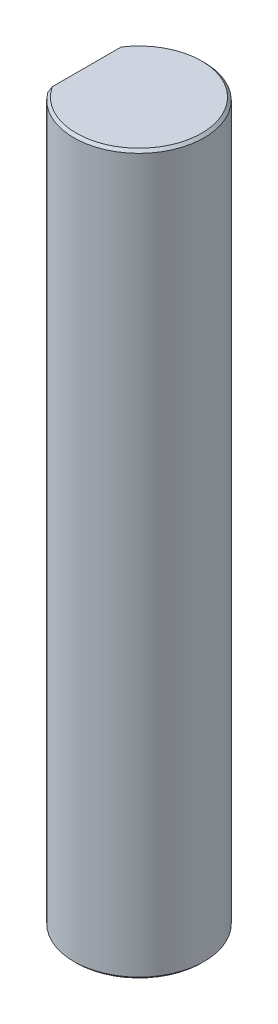
ISO-10303-21;
HEADER;
FILE_DESCRIPTION(('STEP AP214'),'2;1');
FILE_NAME('part.step','',(''),(''),'','','');
FILE_SCHEMA(('AUTOMOTIVE_DESIGN { 1 0 10303 214 1 1 1 1 }'));
ENDSEC;
DATA;
#1=APPLICATION_CONTEXT('core data for automotive mechanical design processes');
#2=APPLICATION_PROTOCOL_DEFINITION('international standard','automotive_design',2000,#1);
#3=PRODUCT_CONTEXT('',#1,'mechanical');
#4=PRODUCT('Part','Part','',(#3));
#5=PRODUCT_RELATED_PRODUCT_CATEGORY('part','',(#4));
#6=PRODUCT_DEFINITION_FORMATION('','',#4);
#7=PRODUCT_DEFINITION_CONTEXT('part definition',#1,'design');
#8=PRODUCT_DEFINITION('design','',#6,#7);
#9=PRODUCT_DEFINITION_SHAPE('','',#8);
#10=(LENGTH_UNIT() NAMED_UNIT(*) SI_UNIT(.MILLI.,.METRE.));
#11=(NAMED_UNIT(*) PLANE_ANGLE_UNIT() SI_UNIT($,.RADIAN.));
#12=(NAMED_UNIT(*) SI_UNIT($,.STERADIAN.) SOLID_ANGLE_UNIT());
#13=UNCERTAINTY_MEASURE_WITH_UNIT(LENGTH_MEASURE(1.E-05),#10,'distance_accuracy_value','');
#14=(GEOMETRIC_REPRESENTATION_CONTEXT(3) GLOBAL_UNCERTAINTY_ASSIGNED_CONTEXT((#13)) GLOBAL_UNIT_ASSIGNED_CONTEXT((#10,
#11,#12)) REPRESENTATION_CONTEXT('',''));
#15=CARTESIAN_POINT('',(0.,0.,0.));
#16=DIRECTION('',(0.,0.,1.));
#17=DIRECTION('',(1.,0.,0.));
#18=AXIS2_PLACEMENT_3D('',#15,#16,#17);
#19=CARTESIAN_POINT('',(-2.54381,34.925,-1.89353550270387));
#20=DIRECTION('',(1.,0.,0.));
#21=DIRECTION('',(0.,0.,-1.));
#22=AXIS2_PLACEMENT_3D('',#19,#20,#21);
#23=PLANE('',#22);
#24=DIRECTION('',(0.,0.,1.));
#25=VECTOR('',#24,1.);
#26=CARTESIAN_POINT('',(-2.54381,34.925,1.89353550270387));
#27=LINE('',#26,#25);
#28=CARTESIAN_POINT('',(-2.54381,34.925,-1.67216130799163));
#29=VERTEX_POINT('',#28);
#30=CARTESIAN_POINT('',(-2.54381,34.925,1.67216130799163));
#31=VERTEX_POINT('',#30);
#32=EDGE_CURVE('E138',#29,#31,#27,.T.);
#33=ORIENTED_EDGE('',*,*,#32,.F.);
#34=CARTESIAN_POINT('',(-2.54381,34.925,-1.67216130799163));
#35=CARTESIAN_POINT('',(-2.54381,34.9044966626707,-1.70943763305416));
#36=CARTESIAN_POINT('',(-2.54381,34.8836616426414,-1.74652367530439));
#37=CARTESIAN_POINT('',(-2.54381,34.8413283071134,-1.8203150722845));
#38=CARTESIAN_POINT('',(-2.54381,34.8198299938063,-1.85702042827168));
#39=CARTESIAN_POINT('',(-2.54381,34.7979999999909,-1.89353550270388));
#40=B_SPLINE_CURVE_WITH_KNOTS('',3,(#34,#35,#36,#37,#38,#39),.UNSPECIFIED.,.F.,.F.,(4,2,4),(0.,
0.127613687763669,0.255226953918805),.UNSPECIFIED.);
#41=CARTESIAN_POINT('',(-2.54381,34.7979999999909,-1.89353550270387));
#42=VERTEX_POINT('',#41);
#43=EDGE_CURVE('E49',#29,#42,#40,.T.);
#44=ORIENTED_EDGE('',*,*,#43,.T.);
#45=DIRECTION('',(0.,-1.,0.));
#46=VECTOR('',#45,1.);
#47=CARTESIAN_POINT('',(-2.54381,34.925,-1.89353550270387));
#48=LINE('',#47,#46);
#49=CARTESIAN_POINT('',(-2.54381,0.127000000044078,-1.89353550270387));
#50=VERTEX_POINT('',#49);
#51=EDGE_CURVE('E77',#42,#50,#48,.T.);
#52=ORIENTED_EDGE('',*,*,#51,.T.);
#53=CARTESIAN_POINT('',(-2.54380999996317,4.40741193541427E-11,-1.67216130798408));
#54=CARTESIAN_POINT('',(-2.54381000042444,0.00501411439717946,-1.68128955351411));
#55=CARTESIAN_POINT('',(-2.54381000882504,0.0100502470336075,-1.69040569787786));
#56=CARTESIAN_POINT('',(-2.54381003266352,0.0201953226391507,-1.70866787814891));
#57=CARTESIAN_POINT('',(-2.54381004814265,0.0253045199337819,-1.71781377277904));
#58=CARTESIAN_POINT('',(-2.54381007716613,0.0355957200603936,-1.73613598515763));
#59=CARTESIAN_POINT('',(-2.54381009069844,0.0407779750322285,-1.74531216126844));
#60=CARTESIAN_POINT('',(-2.54381011027738,0.0512152945980245,-1.7636954537754));
#61=CARTESIAN_POINT('',(-2.54381011627888,0.0564706091047189,-1.77290242827139));
#62=CARTESIAN_POINT('',(-2.54381011823008,0.0670540493882945,-1.79134782044395));
#63=CARTESIAN_POINT('',(-2.54381011411935,0.0723824227518353,-1.80058609605104));
#64=CARTESIAN_POINT('',(-2.54381009707124,0.0831119837402126,-1.81909457916978));
#65=CARTESIAN_POINT('',(-2.54381008408091,0.0885134165586668,-1.8283646445309));
#66=CARTESIAN_POINT('',(-2.54381005426785,0.0993890969974255,-1.84693718221852));
#67=CARTESIAN_POINT('',(-2.54381003742246,0.104863587337332,-1.85623951239918));
#68=CARTESIAN_POINT('',(-2.54381001066232,0.115885392317375,-1.87487704005022));
#69=CARTESIAN_POINT('',(-2.54381000079014,0.12143294719951,-1.88421209545314));
#70=CARTESIAN_POINT('',(-2.54380999996464,0.127000000044076,-1.89353550267756));
#71=B_SPLINE_CURVE_WITH_KNOTS('',3,(#53,#54,#55,#56,#57,#58,#59,#60,#61,#62,#63,#64,#65,#66,#67,
#68,#69,#70),.UNSPECIFIED.,.F.,.F.,(4,2,2,2,2,2,2,2,4),(0.,0.0312440948661208,
0.0626726522340686,0.09428775490835,0.126091425320246,0.158085626719837,0.190272264369233,
0.222653186735185,0.255230186679351),.UNSPECIFIED.);
#72=CARTESIAN_POINT('',(-2.54380999996317,0.,-1.67216130790384));
#73=VERTEX_POINT('',#72);
#74=EDGE_CURVE('E80',#73,#50,#71,.T.);
#75=ORIENTED_EDGE('',*,*,#74,.F.);
#76=DIRECTION('',(0.,0.,-1.));
#77=VECTOR('',#76,1.);
#78=CARTESIAN_POINT('',(-2.54381,0.,-1.89353550270387));
#79=LINE('',#78,#77);
#80=CARTESIAN_POINT('',(-2.54380999998158,2.20370596770714E-11,1.67216130791595));
#81=VERTEX_POINT('',#80);
#82=EDGE_CURVE('E94',#81,#73,#79,.T.);
#83=ORIENTED_EDGE('',*,*,#82,.F.);
#84=CARTESIAN_POINT('',(-2.54380999996464,0.127000000044076,1.89353550267756));
#85=CARTESIAN_POINT('',(-2.54381000079014,0.121432947199514,1.88421209545315));
#86=CARTESIAN_POINT('',(-2.54381001066232,0.115885392317384,1.87487704005024));
#87=CARTESIAN_POINT('',(-2.54381003742246,0.104863587337348,1.85623951239921));
#88=CARTESIAN_POINT('',(-2.54381005426785,0.0993890969974452,1.84693718221856));
#89=CARTESIAN_POINT('',(-2.5438100840809,0.0885134165586913,1.82836464453095));
#90=CARTESIAN_POINT('',(-2.54381009707123,0.0831119837402387,1.81909457916983));
#91=CARTESIAN_POINT('',(-2.54381011411935,0.072382422751864,1.80058609605109));
#92=CARTESIAN_POINT('',(-2.54381011823008,0.0670540493883241,1.791347820444));
#93=CARTESIAN_POINT('',(-2.54381011627888,0.056470609104749,1.77290242827144));
#94=CARTESIAN_POINT('',(-2.54381011027739,0.0512152945980542,1.76369545377545));
#95=CARTESIAN_POINT('',(-2.54381009069845,0.0407779750322554,1.74531216126848));
#96=CARTESIAN_POINT('',(-2.54381007716613,0.0355957200604182,1.73613598515767));
#97=CARTESIAN_POINT('',(-2.54381004814266,0.0253045199338011,1.71781377277907));
#98=CARTESIAN_POINT('',(-2.54381003266352,0.0201953226391669,1.70866787814894));
#99=CARTESIAN_POINT('',(-2.54381000882504,0.0100502470336163,1.69040569787787));
#100=CARTESIAN_POINT('',(-2.54381000042444,0.00501411439718394,1.68128955351412));
#101=CARTESIAN_POINT('',(-2.54380999996317,4.40741193541427E-11,1.67216130798408));
#102=B_SPLINE_CURVE_WITH_KNOTS('',3,(#84,#85,#86,#87,#88,#89,#90,#91,#92,#93,#94,#95,#96,#97,
#98,#99,#100,#101),.UNSPECIFIED.,.F.,.F.,(4,2,2,2,2,2,2,2,4),(0.,0.0325769999441396,
0.0649579223100719,0.0971445599594568,0.129138761359048,0.16094243177095,0.192557534445239,
0.223986091813204,0.255230186679352),.UNSPECIFIED.);
#103=CARTESIAN_POINT('',(-2.54380999998232,0.127000000022039,1.89353550269071));
#104=VERTEX_POINT('',#103);
#105=EDGE_CURVE('E82',#104,#81,#102,.T.);
#106=ORIENTED_EDGE('',*,*,#105,.F.);
#107=DIRECTION('',(0.,-1.,0.));
#108=VECTOR('',#107,1.);
#109=CARTESIAN_POINT('',(-2.54381,34.925,1.89353550270387));
#110=LINE('',#109,#108);
#111=CARTESIAN_POINT('',(-2.54381,34.7979999999909,1.89353550270387));
#112=VERTEX_POINT('',#111);
#113=EDGE_CURVE('E83',#112,#104,#110,.T.);
#114=ORIENTED_EDGE('',*,*,#113,.F.);
#115=CARTESIAN_POINT('',(-2.54381,34.7979999999909,1.89353550270387));
#116=CARTESIAN_POINT('',(-2.54381,34.8198299938063,1.85702042827168));
#117=CARTESIAN_POINT('',(-2.54381,34.8413283071134,1.8203150722845));
#118=CARTESIAN_POINT('',(-2.54381,34.8836616426414,1.74652367530439));
#119=CARTESIAN_POINT('',(-2.54381,34.9044966626707,1.70943763305416));
#120=CARTESIAN_POINT('',(-2.54381,34.925,1.67216130799163));
#121=B_SPLINE_CURVE_WITH_KNOTS('',3,(#115,#116,#117,#118,#119,#120),.UNSPECIFIED.,.F.,.F.,(4,2,
4),(0.,0.127613266155132,0.255226953918802),.UNSPECIFIED.);
#122=EDGE_CURVE('E104',#112,#31,#121,.T.);
#123=ORIENTED_EDGE('',*,*,#122,.T.);
#124=EDGE_LOOP('',(#33,#44,#52,#75,#83,#106,#114,#123));
#125=FACE_BOUND('',#124,.T.);
#126=ADVANCED_FACE('F40',(#125),#23,.F.);
#127=CARTESIAN_POINT('',(0.,0.,0.));
#128=DIRECTION('',(0.,1.,0.));
#129=DIRECTION('',(0.,0.,1.));
#130=AXIS2_PLACEMENT_3D('',#127,#128,#129);
#131=PLANE('',#130);
#132=ORIENTED_EDGE('',*,*,#82,.T.);
#133=CARTESIAN_POINT('',(0.,0.,0.));
#134=DIRECTION('',(0.,1.,0.));
#135=DIRECTION('',(0.,0.,1.));
#136=AXIS2_PLACEMENT_3D('',#133,#134,#135);
#137=CIRCLE('',#136,3.04418999991185);
#138=EDGE_CURVE('E91',#81,#73,#137,.T.);
#139=ORIENTED_EDGE('',*,*,#138,.F.);
#140=EDGE_LOOP('',(#132,#139));
#141=FACE_BOUND('',#140,.T.);
#142=ADVANCED_FACE('F123',(#141),#131,.F.);
#143=CARTESIAN_POINT('',(0.,0.127000000020416,0.));
#144=DIRECTION('',(0.,1.,0.));
#145=DIRECTION('',(0.,0.,1.));
#146=AXIS2_PLACEMENT_3D('',#143,#144,#145);
#147=CONICAL_SURFACE('',#146,3.17118999993227,0.785398163397448);
#148=CARTESIAN_POINT('',(0.,0.127000000000002,0.));
#149=DIRECTION('',(0.,-1.,0.));
#150=DIRECTION('',(0.,0.,-1.));
#151=AXIS2_PLACEMENT_3D('',#148,#149,#150);
#152=CIRCLE('',#151,3.17119);
#153=EDGE_CURVE('E89',#104,#50,#152,.F.);
#154=ORIENTED_EDGE('',*,*,#153,.F.);
#155=ORIENTED_EDGE('',*,*,#105,.T.);
#156=ORIENTED_EDGE('',*,*,#138,.T.);
#157=ORIENTED_EDGE('',*,*,#74,.T.);
#158=EDGE_LOOP('',(#154,#155,#156,#157));
#159=FACE_BOUND('',#158,.T.);
#160=ADVANCED_FACE('F87',(#159),#147,.T.);
#161=CARTESIAN_POINT('',(0.,34.925,0.));
#162=DIRECTION('',(0.,-1.,0.));
#163=DIRECTION('',(0.,0.,-1.));
#164=AXIS2_PLACEMENT_3D('',#161,#162,#163);
#165=CYLINDRICAL_SURFACE('',#164,3.17119);
#166=ORIENTED_EDGE('',*,*,#51,.F.);
#167=CARTESIAN_POINT('',(0.,34.7979999999909,0.));
#168=DIRECTION('',(0.,-1.,0.));
#169=DIRECTION('',(0.,0.,-1.));
#170=AXIS2_PLACEMENT_3D('',#167,#168,#169);
#171=CIRCLE('',#170,3.17119);
#172=EDGE_CURVE('E12',#42,#112,#171,.T.);
#173=ORIENTED_EDGE('',*,*,#172,.T.);
#174=ORIENTED_EDGE('',*,*,#113,.T.);
#175=ORIENTED_EDGE('',*,*,#153,.T.);
#176=EDGE_LOOP('',(#166,#173,#174,#175));
#177=FACE_BOUND('',#176,.T.);
#178=ADVANCED_FACE('F96',(#177),#165,.T.);
#179=CARTESIAN_POINT('',(0.,34.925,0.));
#180=DIRECTION('',(0.,-1.,0.));
#181=DIRECTION('',(0.,0.,-1.));
#182=AXIS2_PLACEMENT_3D('',#179,#180,#181);
#183=PLANE('',#182);
#184=ORIENTED_EDGE('',*,*,#32,.T.);
#185=CARTESIAN_POINT('',(0.,34.925,0.));
#186=DIRECTION('',(0.,-1.,0.));
#187=DIRECTION('',(0.,0.,-1.));
#188=AXIS2_PLACEMENT_3D('',#185,#186,#187);
#189=CIRCLE('',#188,3.04418999999085);
#190=EDGE_CURVE('E98',#31,#29,#189,.F.);
#191=ORIENTED_EDGE('',*,*,#190,.T.);
#192=EDGE_LOOP('',(#184,#191));
#193=FACE_BOUND('',#192,.T.);
#194=ADVANCED_FACE('F142',(#193),#183,.F.);
#195=CARTESIAN_POINT('',(0.,34.925,0.));
#196=DIRECTION('',(0.,-1.,0.));
#197=DIRECTION('',(0.,0.,-1.));
#198=AXIS2_PLACEMENT_3D('',#195,#196,#197);
#199=CONICAL_SURFACE('',#198,3.04418999999085,0.78539816339747);
#200=ORIENTED_EDGE('',*,*,#122,.F.);
#201=ORIENTED_EDGE('',*,*,#172,.F.);
#202=ORIENTED_EDGE('',*,*,#43,.F.);
#203=ORIENTED_EDGE('',*,*,#190,.F.);
#204=EDGE_LOOP('',(#200,#201,#202,#203));
#205=FACE_BOUND('',#204,.T.);
#206=ADVANCED_FACE('F42',(#205),#199,.T.);
#207=CLOSED_SHELL('',(#126,#142,#160,#178,#194,#206));
#208=MANIFOLD_SOLID_BREP('B2',#207);
#209=ADVANCED_BREP_SHAPE_REPRESENTATION('',(#18,#208),#14);
#210=SHAPE_DEFINITION_REPRESENTATION(#9,#209);
ENDSEC;
END-ISO-10303-21;
